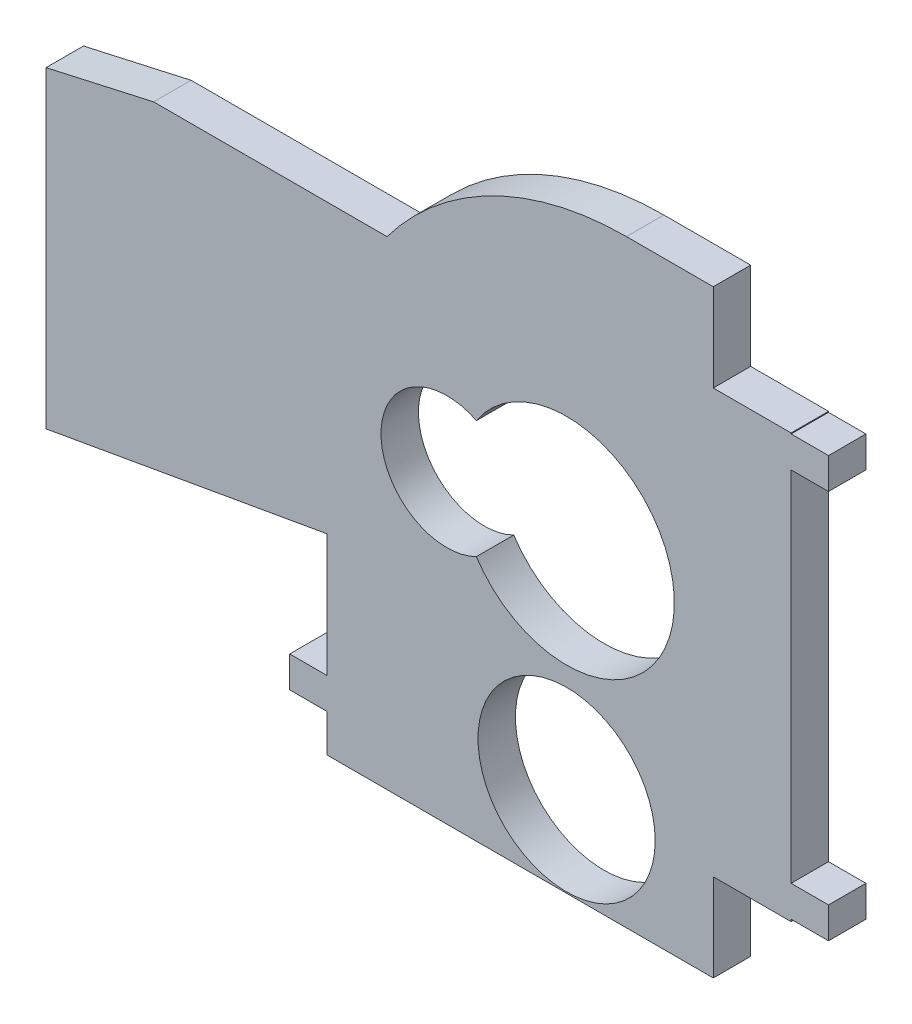
ISO-10303-21;
HEADER;
FILE_DESCRIPTION(('STEP AP214'),'2;1');
FILE_NAME('part.step','',(''),(''),'','','');
FILE_SCHEMA(('AUTOMOTIVE_DESIGN { 1 0 10303 214 1 1 1 1 }'));
ENDSEC;
DATA;
#1=APPLICATION_CONTEXT('core data for automotive mechanical design processes');
#2=APPLICATION_PROTOCOL_DEFINITION('international standard','automotive_design',2000,#1);
#3=PRODUCT_CONTEXT('',#1,'mechanical');
#4=PRODUCT('Part','Part','',(#3));
#5=PRODUCT_RELATED_PRODUCT_CATEGORY('part','',(#4));
#6=PRODUCT_DEFINITION_FORMATION('','',#4);
#7=PRODUCT_DEFINITION_CONTEXT('part definition',#1,'design');
#8=PRODUCT_DEFINITION('design','',#6,#7);
#9=PRODUCT_DEFINITION_SHAPE('','',#8);
#10=(LENGTH_UNIT() NAMED_UNIT(*) SI_UNIT(.MILLI.,.METRE.));
#11=(NAMED_UNIT(*) PLANE_ANGLE_UNIT() SI_UNIT($,.RADIAN.));
#12=(NAMED_UNIT(*) SI_UNIT($,.STERADIAN.) SOLID_ANGLE_UNIT());
#13=UNCERTAINTY_MEASURE_WITH_UNIT(LENGTH_MEASURE(1.E-05),#10,'distance_accuracy_value','');
#14=(GEOMETRIC_REPRESENTATION_CONTEXT(3) GLOBAL_UNCERTAINTY_ASSIGNED_CONTEXT((#13)) GLOBAL_UNIT_ASSIGNED_CONTEXT((#10,
#11,#12)) REPRESENTATION_CONTEXT('',''));
#15=CARTESIAN_POINT('',(0.,0.,0.));
#16=DIRECTION('',(0.,0.,1.));
#17=DIRECTION('',(1.,0.,0.));
#18=AXIS2_PLACEMENT_3D('',#15,#16,#17);
#19=CARTESIAN_POINT('',(-4.40979382225198,-23.9242218820393,1.5875));
#20=DIRECTION('',(0.,0.,1.));
#21=DIRECTION('',(1.,0.,0.));
#22=AXIS2_PLACEMENT_3D('',#19,#20,#21);
#23=PLANE('',#22);
#24=CARTESIAN_POINT('',(-5.08,9.144,1.5875));
#25=DIRECTION('',(0.,0.,1.));
#26=DIRECTION('',(1.,0.,0.));
#27=AXIS2_PLACEMENT_3D('',#24,#25,#26);
#28=CIRCLE('',#27,2.794);
#29=CARTESIAN_POINT('',(-3.82905,11.6423114492593,1.5875));
#30=VERTEX_POINT('',#29);
#31=CARTESIAN_POINT('',(-3.82905,6.64568855074072,1.5875));
#32=VERTEX_POINT('',#31);
#33=EDGE_CURVE('E259',#30,#32,#28,.T.);
#34=ORIENTED_EDGE('',*,*,#33,.F.);
#35=CARTESIAN_POINT('',(0.,9.144,1.5875));
#36=DIRECTION('',(0.,0.,1.));
#37=DIRECTION('',(1.,0.,0.));
#38=AXIS2_PLACEMENT_3D('',#35,#36,#37);
#39=CIRCLE('',#38,4.572);
#40=EDGE_CURVE('E262',#32,#30,#39,.T.);
#41=ORIENTED_EDGE('',*,*,#40,.F.);
#42=EDGE_LOOP('',(#34,#41));
#43=FACE_BOUND('',#42,.T.);
#44=CARTESIAN_POINT('',(0.,0.,1.5875));
#45=DIRECTION('',(0.,0.,1.));
#46=DIRECTION('',(1.,0.,0.));
#47=AXIS2_PLACEMENT_3D('',#44,#45,#46);
#48=CIRCLE('',#47,3.7592);
#49=CARTESIAN_POINT('',(3.7592,0.,1.5875));
#50=VERTEX_POINT('',#49);
#51=EDGE_CURVE('E266',#50,#50,#48,.T.);
#52=ORIENTED_EDGE('',*,*,#51,.F.);
#53=EDGE_LOOP('',(#52));
#54=FACE_BOUND('',#53,.T.);
#55=DIRECTION('',(1.,0.,0.));
#56=VECTOR('',#55,1.);
#57=CARTESIAN_POINT('',(-5.48621075951455,17.8689,1.5875));
#58=LINE('',#57,#56);
#59=CARTESIAN_POINT('',(6.22299999999988,17.8689,1.5875));
#60=VERTEX_POINT('',#59);
#61=CARTESIAN_POINT('',(9.52499999999987,17.8689,1.5875));
#62=VERTEX_POINT('',#61);
#63=EDGE_CURVE('E52',#60,#62,#58,.T.);
#64=ORIENTED_EDGE('',*,*,#63,.F.);
#65=DIRECTION('',(0.,1.,0.));
#66=VECTOR('',#65,1.);
#67=CARTESIAN_POINT('',(6.22299999999989,-23.7640869080621,1.5875));
#68=LINE('',#67,#66);
#69=CARTESIAN_POINT('',(6.22299999999988,21.59,1.5875));
#70=VERTEX_POINT('',#69);
#71=EDGE_CURVE('E221',#60,#70,#68,.T.);
#72=ORIENTED_EDGE('',*,*,#71,.T.);
#73=DIRECTION('',(1.,0.,0.));
#74=VECTOR('',#73,1.);
#75=CARTESIAN_POINT('',(-4.40979382225196,21.59,1.5875));
#76=LINE('',#75,#74);
#77=CARTESIAN_POINT('',(2.53999999999987,21.59,1.5875));
#78=VERTEX_POINT('',#77);
#79=EDGE_CURVE('E269',#78,#70,#76,.T.);
#80=ORIENTED_EDGE('',*,*,#79,.F.);
#81=CARTESIAN_POINT('',(2.53999999999988,8.89,1.5875));
#82=DIRECTION('',(0.,0.,1.));
#83=DIRECTION('',(1.,0.,0.));
#84=AXIS2_PLACEMENT_3D('',#81,#82,#83);
#85=CIRCLE('',#84,12.7);
#86=CARTESIAN_POINT('',(-7.62000000000013,16.51,1.5875));
#87=VERTEX_POINT('',#86);
#88=EDGE_CURVE('E272',#78,#87,#85,.T.);
#89=ORIENTED_EDGE('',*,*,#88,.T.);
#90=DIRECTION('',(-1.,0.,0.));
#91=VECTOR('',#90,1.);
#92=CARTESIAN_POINT('',(-4.40979382225199,16.51,1.5875));
#93=LINE('',#92,#91);
#94=CARTESIAN_POINT('',(-17.5194607595146,16.51,1.5875));
#95=VERTEX_POINT('',#94);
#96=EDGE_CURVE('E275',#87,#95,#93,.T.);
#97=ORIENTED_EDGE('',*,*,#96,.T.);
#98=DIRECTION('',(0.975802126437272,0.218655459663136,0.));
#99=VECTOR('',#98,1.);
#100=CARTESIAN_POINT('',(-13.6637957704053,17.3739683985716,1.5875));
#101=LINE('',#100,#99);
#102=CARTESIAN_POINT('',(-22.0849215190291,15.4869822242647,1.5875));
#103=VERTEX_POINT('',#102);
#104=EDGE_CURVE('E277',#103,#95,#101,.T.);
#105=ORIENTED_EDGE('',*,*,#104,.F.);
#106=DIRECTION('',(0.,1.,0.));
#107=VECTOR('',#106,1.);
#108=CARTESIAN_POINT('',(-22.0849215190291,-23.9242218820393,1.5875));
#109=LINE('',#108,#107);
#110=CARTESIAN_POINT('',(-22.0849215190291,2.21200741234466,1.5875));
#111=VERTEX_POINT('',#110);
#112=EDGE_CURVE('E280',#111,#103,#109,.T.);
#113=ORIENTED_EDGE('',*,*,#112,.F.);
#114=DIRECTION('',(0.984761013296185,0.173913043478261,0.));
#115=VECTOR('',#114,1.);
#116=CARTESIAN_POINT('',(-9.42055467360718,4.44858923481173,1.5875));
#117=LINE('',#116,#115);
#118=CARTESIAN_POINT('',(-10.1600000000001,4.318,1.5875));
#119=VERTEX_POINT('',#118);
#120=EDGE_CURVE('E283',#111,#119,#117,.T.);
#121=ORIENTED_EDGE('',*,*,#120,.T.);
#122=DIRECTION('',(0.,-1.,0.));
#123=VECTOR('',#122,1.);
#124=CARTESIAN_POINT('',(-10.1600000000001,-23.9242218820393,1.5875));
#125=LINE('',#124,#123);
#126=CARTESIAN_POINT('',(-10.1600000000001,-0.889000000000001,1.5875));
#127=VERTEX_POINT('',#126);
#128=EDGE_CURVE('E286',#119,#127,#125,.T.);
#129=ORIENTED_EDGE('',*,*,#128,.T.);
#130=DIRECTION('',(1.,0.,0.));
#131=VECTOR('',#130,1.);
#132=CARTESIAN_POINT('',(-4.40979382225198,-0.889000000000001,1.5875));
#133=LINE('',#132,#131);
#134=CARTESIAN_POINT('',(-11.7475000000001,-0.889000000000001,1.5875));
#135=VERTEX_POINT('',#134);
#136=EDGE_CURVE('E288',#135,#127,#133,.T.);
#137=ORIENTED_EDGE('',*,*,#136,.F.);
#138=DIRECTION('',(0.,1.,0.));
#139=VECTOR('',#138,1.);
#140=CARTESIAN_POINT('',(-11.7475000000001,-23.9242218820393,1.5875));
#141=LINE('',#140,#139);
#142=CARTESIAN_POINT('',(-11.7475000000001,-2.2098,1.5875));
#143=VERTEX_POINT('',#142);
#144=EDGE_CURVE('E292',#143,#135,#141,.T.);
#145=ORIENTED_EDGE('',*,*,#144,.F.);
#146=DIRECTION('',(1.,0.,0.));
#147=VECTOR('',#146,1.);
#148=CARTESIAN_POINT('',(-4.40979382225198,-2.2098,1.5875));
#149=LINE('',#148,#147);
#150=CARTESIAN_POINT('',(-10.1600000000001,-2.2098,1.5875));
#151=VERTEX_POINT('',#150);
#152=EDGE_CURVE('E295',#143,#151,#149,.T.);
#153=ORIENTED_EDGE('',*,*,#152,.T.);
#154=CARTESIAN_POINT('',(-10.1600000000001,-3.81,1.5875));
#155=VERTEX_POINT('',#154);
#156=EDGE_CURVE('E289',#151,#155,#125,.T.);
#157=ORIENTED_EDGE('',*,*,#156,.T.);
#158=DIRECTION('',(1.,0.,0.));
#159=VECTOR('',#158,1.);
#160=CARTESIAN_POINT('',(-4.40979382225198,-3.81,1.5875));
#161=LINE('',#160,#159);
#162=CARTESIAN_POINT('',(6.22299999999988,-3.81,1.5875));
#163=VERTEX_POINT('',#162);
#164=EDGE_CURVE('E298',#155,#163,#161,.T.);
#165=ORIENTED_EDGE('',*,*,#164,.T.);
#166=DIRECTION('',(0.,1.,0.));
#167=VECTOR('',#166,1.);
#168=CARTESIAN_POINT('',(6.22299999999988,-23.7640869080621,1.5875));
#169=LINE('',#168,#167);
#170=CARTESIAN_POINT('',(6.22299999999988,-0.0889000000000133,1.5875));
#171=VERTEX_POINT('',#170);
#172=EDGE_CURVE('E248',#163,#171,#169,.T.);
#173=ORIENTED_EDGE('',*,*,#172,.T.);
#174=DIRECTION('',(1.,0.,0.));
#175=VECTOR('',#174,1.);
#176=CARTESIAN_POINT('',(-5.48621075951455,-0.0889000000000098,1.5875));
#177=LINE('',#176,#175);
#178=CARTESIAN_POINT('',(9.52499999999988,-0.0889000000000098,1.5875));
#179=VERTEX_POINT('',#178);
#180=EDGE_CURVE('E245',#171,#179,#177,.T.);
#181=ORIENTED_EDGE('',*,*,#180,.T.);
#182=DIRECTION('',(0.,-1.,0.));
#183=VECTOR('',#182,1.);
#184=CARTESIAN_POINT('',(9.52499999999988,-23.9242218820393,1.5875));
#185=LINE('',#184,#183);
#186=CARTESIAN_POINT('',(9.52499999999988,0.,1.5875));
#187=VERTEX_POINT('',#186);
#188=EDGE_CURVE('E301',#187,#179,#185,.T.);
#189=ORIENTED_EDGE('',*,*,#188,.F.);
#190=DIRECTION('',(1.,0.,0.));
#191=VECTOR('',#190,1.);
#192=CARTESIAN_POINT('',(-4.40979382225199,0.,1.5875));
#193=LINE('',#192,#191);
#194=CARTESIAN_POINT('',(11.1125,0.,1.5875));
#195=VERTEX_POINT('',#194);
#196=EDGE_CURVE('E304',#187,#195,#193,.T.);
#197=ORIENTED_EDGE('',*,*,#196,.T.);
#198=DIRECTION('',(0.,1.,0.));
#199=VECTOR('',#198,1.);
#200=CARTESIAN_POINT('',(11.1125,-23.9242218820393,1.5875));
#201=LINE('',#200,#199);
#202=CARTESIAN_POINT('',(11.1125,1.3208,1.5875));
#203=VERTEX_POINT('',#202);
#204=EDGE_CURVE('E309',#195,#203,#201,.T.);
#205=ORIENTED_EDGE('',*,*,#204,.T.);
#206=DIRECTION('',(1.,0.,0.));
#207=VECTOR('',#206,1.);
#208=CARTESIAN_POINT('',(-4.40979382225198,1.3208,1.5875));
#209=LINE('',#208,#207);
#210=CARTESIAN_POINT('',(9.52499999999988,1.3208,1.5875));
#211=VERTEX_POINT('',#210);
#212=EDGE_CURVE('E311',#211,#203,#209,.T.);
#213=ORIENTED_EDGE('',*,*,#212,.F.);
#214=CARTESIAN_POINT('',(9.52499999999985,16.51,1.5875));
#215=VERTEX_POINT('',#214);
#216=EDGE_CURVE('E306',#215,#211,#185,.T.);
#217=ORIENTED_EDGE('',*,*,#216,.F.);
#218=DIRECTION('',(1.,0.,0.));
#219=VECTOR('',#218,1.);
#220=CARTESIAN_POINT('',(-4.40979382225198,16.51,1.5875));
#221=LINE('',#220,#219);
#222=CARTESIAN_POINT('',(11.1124999999999,16.51,1.5875));
#223=VERTEX_POINT('',#222);
#224=EDGE_CURVE('E314',#215,#223,#221,.T.);
#225=ORIENTED_EDGE('',*,*,#224,.T.);
#226=DIRECTION('',(0.,1.,0.));
#227=VECTOR('',#226,1.);
#228=CARTESIAN_POINT('',(11.1124999999999,-23.9242218820393,1.5875));
#229=LINE('',#228,#227);
#230=CARTESIAN_POINT('',(11.1124999999999,17.8308,1.5875));
#231=VERTEX_POINT('',#230);
#232=EDGE_CURVE('E317',#223,#231,#229,.T.);
#233=ORIENTED_EDGE('',*,*,#232,.T.);
#234=DIRECTION('',(1.,0.,0.));
#235=VECTOR('',#234,1.);
#236=CARTESIAN_POINT('',(-4.40979382225198,17.8308,1.5875));
#237=LINE('',#236,#235);
#238=CARTESIAN_POINT('',(9.52499999999987,17.8308,1.5875));
#239=VERTEX_POINT('',#238);
#240=EDGE_CURVE('E319',#239,#231,#237,.T.);
#241=ORIENTED_EDGE('',*,*,#240,.F.);
#242=EDGE_CURVE('E305',#62,#239,#185,.T.);
#243=ORIENTED_EDGE('',*,*,#242,.F.);
#244=EDGE_LOOP('',(#64,#72,#80,#89,#97,#105,#113,#121,#129,#137,#145,#153,#157,#165,#173,#181,
#189,#197,#205,#213,#217,#225,#233,#241,#243));
#245=FACE_BOUND('',#244,.T.);
#246=ADVANCED_FACE('F35',(#43,#54,#245),#23,.T.);
#247=CARTESIAN_POINT('',(-4.40979382225198,-23.9242218820393,0.));
#248=DIRECTION('',(0.,0.,1.));
#249=DIRECTION('',(1.,0.,0.));
#250=AXIS2_PLACEMENT_3D('',#247,#248,#249);
#251=PLANE('',#250);
#252=CARTESIAN_POINT('',(-5.08,9.144,0.));
#253=DIRECTION('',(0.,0.,1.));
#254=DIRECTION('',(1.,0.,0.));
#255=AXIS2_PLACEMENT_3D('',#252,#253,#254);
#256=CIRCLE('',#255,2.794);
#257=CARTESIAN_POINT('',(-3.82905,11.6423114492593,0.));
#258=VERTEX_POINT('',#257);
#259=CARTESIAN_POINT('',(-3.82905,6.64568855074072,0.));
#260=VERTEX_POINT('',#259);
#261=EDGE_CURVE('E258',#258,#260,#256,.T.);
#262=ORIENTED_EDGE('',*,*,#261,.T.);
#263=CARTESIAN_POINT('',(0.,9.144,0.));
#264=DIRECTION('',(0.,0.,1.));
#265=DIRECTION('',(1.,0.,0.));
#266=AXIS2_PLACEMENT_3D('',#263,#264,#265);
#267=CIRCLE('',#266,4.572);
#268=EDGE_CURVE('E324',#260,#258,#267,.T.);
#269=ORIENTED_EDGE('',*,*,#268,.T.);
#270=EDGE_LOOP('',(#262,#269));
#271=FACE_BOUND('',#270,.T.);
#272=CARTESIAN_POINT('',(0.,0.,0.));
#273=DIRECTION('',(0.,0.,1.));
#274=DIRECTION('',(1.,0.,0.));
#275=AXIS2_PLACEMENT_3D('',#272,#273,#274);
#276=CIRCLE('',#275,3.7592);
#277=CARTESIAN_POINT('',(3.7592,0.,0.));
#278=VERTEX_POINT('',#277);
#279=EDGE_CURVE('E327',#278,#278,#276,.T.);
#280=ORIENTED_EDGE('',*,*,#279,.T.);
#281=EDGE_LOOP('',(#280));
#282=FACE_BOUND('',#281,.T.);
#283=DIRECTION('',(0.,-1.,0.));
#284=VECTOR('',#283,1.);
#285=CARTESIAN_POINT('',(6.22299999999989,-23.7640869080621,0.));
#286=LINE('',#285,#284);
#287=CARTESIAN_POINT('',(6.22299999999988,21.59,0.));
#288=VERTEX_POINT('',#287);
#289=CARTESIAN_POINT('',(6.22299999999988,17.8689,0.));
#290=VERTEX_POINT('',#289);
#291=EDGE_CURVE('E218',#288,#290,#286,.T.);
#292=ORIENTED_EDGE('',*,*,#291,.T.);
#293=DIRECTION('',(-1.,0.,0.));
#294=VECTOR('',#293,1.);
#295=CARTESIAN_POINT('',(-5.48621075951455,17.8689,0.));
#296=LINE('',#295,#294);
#297=CARTESIAN_POINT('',(9.52499999999987,17.8689,0.));
#298=VERTEX_POINT('',#297);
#299=EDGE_CURVE('E225',#298,#290,#296,.T.);
#300=ORIENTED_EDGE('',*,*,#299,.F.);
#301=DIRECTION('',(0.,-1.,0.));
#302=VECTOR('',#301,1.);
#303=CARTESIAN_POINT('',(9.52499999999988,-23.9242218820393,0.));
#304=LINE('',#303,#302);
#305=CARTESIAN_POINT('',(9.52499999999987,17.8308,0.));
#306=VERTEX_POINT('',#305);
#307=EDGE_CURVE('E263',#298,#306,#304,.T.);
#308=ORIENTED_EDGE('',*,*,#307,.T.);
#309=DIRECTION('',(1.,0.,0.));
#310=VECTOR('',#309,1.);
#311=CARTESIAN_POINT('',(-4.40979382225198,17.8308,0.));
#312=LINE('',#311,#310);
#313=CARTESIAN_POINT('',(11.1124999999999,17.8308,0.));
#314=VERTEX_POINT('',#313);
#315=EDGE_CURVE('E381',#306,#314,#312,.T.);
#316=ORIENTED_EDGE('',*,*,#315,.T.);
#317=DIRECTION('',(0.,1.,0.));
#318=VECTOR('',#317,1.);
#319=CARTESIAN_POINT('',(11.1124999999999,-23.9242218820393,0.));
#320=LINE('',#319,#318);
#321=CARTESIAN_POINT('',(11.1124999999999,16.51,0.));
#322=VERTEX_POINT('',#321);
#323=EDGE_CURVE('E378',#322,#314,#320,.T.);
#324=ORIENTED_EDGE('',*,*,#323,.F.);
#325=DIRECTION('',(1.,0.,0.));
#326=VECTOR('',#325,1.);
#327=CARTESIAN_POINT('',(-4.40979382225198,16.51,0.));
#328=LINE('',#327,#326);
#329=CARTESIAN_POINT('',(9.52499999999985,16.51,0.));
#330=VERTEX_POINT('',#329);
#331=EDGE_CURVE('E375',#330,#322,#328,.T.);
#332=ORIENTED_EDGE('',*,*,#331,.F.);
#333=CARTESIAN_POINT('',(9.52499999999988,1.3208,0.));
#334=VERTEX_POINT('',#333);
#335=EDGE_CURVE('E366',#330,#334,#304,.T.);
#336=ORIENTED_EDGE('',*,*,#335,.T.);
#337=DIRECTION('',(1.,0.,0.));
#338=VECTOR('',#337,1.);
#339=CARTESIAN_POINT('',(-4.40979382225198,1.3208,0.));
#340=LINE('',#339,#338);
#341=CARTESIAN_POINT('',(11.1125,1.3208,0.));
#342=VERTEX_POINT('',#341);
#343=EDGE_CURVE('E372',#334,#342,#340,.T.);
#344=ORIENTED_EDGE('',*,*,#343,.T.);
#345=DIRECTION('',(0.,1.,0.));
#346=VECTOR('',#345,1.);
#347=CARTESIAN_POINT('',(11.1125,-23.9242218820393,0.));
#348=LINE('',#347,#346);
#349=CARTESIAN_POINT('',(11.1125,0.,0.));
#350=VERTEX_POINT('',#349);
#351=EDGE_CURVE('E369',#350,#342,#348,.T.);
#352=ORIENTED_EDGE('',*,*,#351,.F.);
#353=DIRECTION('',(1.,0.,0.));
#354=VECTOR('',#353,1.);
#355=CARTESIAN_POINT('',(-4.40979382225199,0.,0.));
#356=LINE('',#355,#354);
#357=CARTESIAN_POINT('',(9.52499999999988,0.,0.));
#358=VERTEX_POINT('',#357);
#359=EDGE_CURVE('E365',#358,#350,#356,.T.);
#360=ORIENTED_EDGE('',*,*,#359,.F.);
#361=CARTESIAN_POINT('',(9.52499999999988,-0.0889000000000098,0.));
#362=VERTEX_POINT('',#361);
#363=EDGE_CURVE('E362',#358,#362,#304,.T.);
#364=ORIENTED_EDGE('',*,*,#363,.T.);
#365=DIRECTION('',(-1.,0.,0.));
#366=VECTOR('',#365,1.);
#367=CARTESIAN_POINT('',(-5.48621075951455,-0.0889000000000098,0.));
#368=LINE('',#367,#366);
#369=CARTESIAN_POINT('',(6.22299999999988,-0.0889000000000133,0.));
#370=VERTEX_POINT('',#369);
#371=EDGE_CURVE('E229',#362,#370,#368,.T.);
#372=ORIENTED_EDGE('',*,*,#371,.T.);
#373=DIRECTION('',(0.,-1.,0.));
#374=VECTOR('',#373,1.);
#375=CARTESIAN_POINT('',(6.22299999999988,-23.7640869080621,0.));
#376=LINE('',#375,#374);
#377=CARTESIAN_POINT('',(6.22299999999988,-3.81,0.));
#378=VERTEX_POINT('',#377);
#379=EDGE_CURVE('E254',#370,#378,#376,.T.);
#380=ORIENTED_EDGE('',*,*,#379,.T.);
#381=DIRECTION('',(1.,0.,0.));
#382=VECTOR('',#381,1.);
#383=CARTESIAN_POINT('',(-4.40979382225198,-3.81,0.));
#384=LINE('',#383,#382);
#385=CARTESIAN_POINT('',(-10.1600000000001,-3.81,0.));
#386=VERTEX_POINT('',#385);
#387=EDGE_CURVE('E359',#386,#378,#384,.T.);
#388=ORIENTED_EDGE('',*,*,#387,.F.);
#389=DIRECTION('',(0.,-1.,0.));
#390=VECTOR('',#389,1.);
#391=CARTESIAN_POINT('',(-10.1600000000001,-23.9242218820393,0.));
#392=LINE('',#391,#390);
#393=CARTESIAN_POINT('',(-10.1600000000001,-2.2098,0.));
#394=VERTEX_POINT('',#393);
#395=EDGE_CURVE('E350',#394,#386,#392,.T.);
#396=ORIENTED_EDGE('',*,*,#395,.F.);
#397=DIRECTION('',(1.,0.,0.));
#398=VECTOR('',#397,1.);
#399=CARTESIAN_POINT('',(-4.40979382225198,-2.2098,0.));
#400=LINE('',#399,#398);
#401=CARTESIAN_POINT('',(-11.7475000000001,-2.2098,0.));
#402=VERTEX_POINT('',#401);
#403=EDGE_CURVE('E356',#402,#394,#400,.T.);
#404=ORIENTED_EDGE('',*,*,#403,.F.);
#405=DIRECTION('',(0.,1.,0.));
#406=VECTOR('',#405,1.);
#407=CARTESIAN_POINT('',(-11.7475000000001,-23.9242218820393,0.));
#408=LINE('',#407,#406);
#409=CARTESIAN_POINT('',(-11.7475000000001,-0.889000000000001,0.));
#410=VERTEX_POINT('',#409);
#411=EDGE_CURVE('E353',#402,#410,#408,.T.);
#412=ORIENTED_EDGE('',*,*,#411,.T.);
#413=DIRECTION('',(1.,0.,0.));
#414=VECTOR('',#413,1.);
#415=CARTESIAN_POINT('',(-4.40979382225198,-0.889000000000001,0.));
#416=LINE('',#415,#414);
#417=CARTESIAN_POINT('',(-10.1600000000001,-0.889000000000001,0.));
#418=VERTEX_POINT('',#417);
#419=EDGE_CURVE('E349',#410,#418,#416,.T.);
#420=ORIENTED_EDGE('',*,*,#419,.T.);
#421=CARTESIAN_POINT('',(-10.1600000000001,4.318,0.));
#422=VERTEX_POINT('',#421);
#423=EDGE_CURVE('E346',#422,#418,#392,.T.);
#424=ORIENTED_EDGE('',*,*,#423,.F.);
#425=DIRECTION('',(0.984761013296185,0.173913043478261,0.));
#426=VECTOR('',#425,1.);
#427=CARTESIAN_POINT('',(-9.42055467360718,4.44858923481173,0.));
#428=LINE('',#427,#426);
#429=CARTESIAN_POINT('',(-22.0849215190291,2.21200741234466,0.));
#430=VERTEX_POINT('',#429);
#431=EDGE_CURVE('E343',#430,#422,#428,.T.);
#432=ORIENTED_EDGE('',*,*,#431,.F.);
#433=DIRECTION('',(0.,1.,0.));
#434=VECTOR('',#433,1.);
#435=CARTESIAN_POINT('',(-22.0849215190291,-23.9242218820393,0.));
#436=LINE('',#435,#434);
#437=CARTESIAN_POINT('',(-22.0849215190291,15.4869822242647,0.));
#438=VERTEX_POINT('',#437);
#439=EDGE_CURVE('E340',#430,#438,#436,.T.);
#440=ORIENTED_EDGE('',*,*,#439,.T.);
#441=DIRECTION('',(0.975802126437272,0.218655459663136,0.));
#442=VECTOR('',#441,1.);
#443=CARTESIAN_POINT('',(-13.6637957704053,17.3739683985716,0.));
#444=LINE('',#443,#442);
#445=CARTESIAN_POINT('',(-17.5194607595146,16.51,0.));
#446=VERTEX_POINT('',#445);
#447=EDGE_CURVE('E337',#438,#446,#444,.T.);
#448=ORIENTED_EDGE('',*,*,#447,.T.);
#449=DIRECTION('',(-1.,0.,0.));
#450=VECTOR('',#449,1.);
#451=CARTESIAN_POINT('',(-4.40979382225199,16.51,0.));
#452=LINE('',#451,#450);
#453=CARTESIAN_POINT('',(-7.62000000000013,16.51,0.));
#454=VERTEX_POINT('',#453);
#455=EDGE_CURVE('E334',#454,#446,#452,.T.);
#456=ORIENTED_EDGE('',*,*,#455,.F.);
#457=CARTESIAN_POINT('',(2.53999999999988,8.89,0.));
#458=DIRECTION('',(0.,0.,1.));
#459=DIRECTION('',(1.,0.,0.));
#460=AXIS2_PLACEMENT_3D('',#457,#458,#459);
#461=CIRCLE('',#460,12.7);
#462=CARTESIAN_POINT('',(2.53999999999987,21.59,0.));
#463=VERTEX_POINT('',#462);
#464=EDGE_CURVE('E331',#463,#454,#461,.T.);
#465=ORIENTED_EDGE('',*,*,#464,.F.);
#466=DIRECTION('',(1.,0.,0.));
#467=VECTOR('',#466,1.);
#468=CARTESIAN_POINT('',(-4.40979382225196,21.59,0.));
#469=LINE('',#468,#467);
#470=EDGE_CURVE('E236',#463,#288,#469,.T.);
#471=ORIENTED_EDGE('',*,*,#470,.T.);
#472=EDGE_LOOP('',(#292,#300,#308,#316,#324,#332,#336,#344,#352,#360,#364,#372,#380,#388,#396,
#404,#412,#420,#424,#432,#440,#448,#456,#465,#471));
#473=FACE_BOUND('',#472,.T.);
#474=ADVANCED_FACE('F233',(#271,#282,#473),#251,.F.);
#475=CARTESIAN_POINT('',(-4.40979382225196,21.59,1.5875));
#476=DIRECTION('',(0.,1.,0.));
#477=DIRECTION('',(-1.,0.,0.));
#478=AXIS2_PLACEMENT_3D('',#475,#476,#477);
#479=PLANE('',#478);
#480=ORIENTED_EDGE('',*,*,#79,.T.);
#481=DIRECTION('',(0.,0.,1.));
#482=VECTOR('',#481,1.);
#483=CARTESIAN_POINT('',(6.22299999999988,21.59,-0.000999999999999916));
#484=LINE('',#483,#482);
#485=EDGE_CURVE('E230',#288,#70,#484,.T.);
#486=ORIENTED_EDGE('',*,*,#485,.F.);
#487=ORIENTED_EDGE('',*,*,#470,.F.);
#488=DIRECTION('',(0.,0.,-1.));
#489=VECTOR('',#488,1.);
#490=CARTESIAN_POINT('',(2.53999999999987,21.59,1.5875));
#491=LINE('',#490,#489);
#492=EDGE_CURVE('E11',#78,#463,#491,.T.);
#493=ORIENTED_EDGE('',*,*,#492,.F.);
#494=EDGE_LOOP('',(#480,#486,#487,#493));
#495=FACE_BOUND('',#494,.T.);
#496=ADVANCED_FACE('F472',(#495),#479,.T.);
#497=CARTESIAN_POINT('',(-4.40979382225198,-3.81,1.5875));
#498=DIRECTION('',(0.,1.,0.));
#499=DIRECTION('',(0.,0.,1.));
#500=AXIS2_PLACEMENT_3D('',#497,#498,#499);
#501=PLANE('',#500);
#502=DIRECTION('',(0.,0.,1.));
#503=VECTOR('',#502,1.);
#504=CARTESIAN_POINT('',(6.22299999999988,-3.81,-0.000999999999999916));
#505=LINE('',#504,#503);
#506=EDGE_CURVE('E60',#378,#163,#505,.T.);
#507=ORIENTED_EDGE('',*,*,#506,.T.);
#508=ORIENTED_EDGE('',*,*,#164,.F.);
#509=DIRECTION('',(0.,0.,-1.));
#510=VECTOR('',#509,1.);
#511=CARTESIAN_POINT('',(-10.1600000000001,-3.81,1.5875));
#512=LINE('',#511,#510);
#513=EDGE_CURVE('E403',#155,#386,#512,.T.);
#514=ORIENTED_EDGE('',*,*,#513,.T.);
#515=ORIENTED_EDGE('',*,*,#387,.T.);
#516=EDGE_LOOP('',(#507,#508,#514,#515));
#517=FACE_BOUND('',#516,.T.);
#518=ADVANCED_FACE('F503',(#517),#501,.F.);
#519=CARTESIAN_POINT('',(9.52499999999988,-23.9242218820393,1.5875));
#520=DIRECTION('',(1.,0.,0.));
#521=DIRECTION('',(0.,1.,0.));
#522=AXIS2_PLACEMENT_3D('',#519,#520,#521);
#523=PLANE('',#522);
#524=ORIENTED_EDGE('',*,*,#188,.T.);
#525=DIRECTION('',(0.,0.,1.));
#526=VECTOR('',#525,1.);
#527=CARTESIAN_POINT('',(9.52499999999988,-0.0889000000000098,-0.000999999999999916));
#528=LINE('',#527,#526);
#529=EDGE_CURVE('E252',#362,#179,#528,.T.);
#530=ORIENTED_EDGE('',*,*,#529,.F.);
#531=ORIENTED_EDGE('',*,*,#363,.F.);
#532=DIRECTION('',(0.,0.,-1.));
#533=VECTOR('',#532,1.);
#534=CARTESIAN_POINT('',(9.52499999999988,0.,1.5875));
#535=LINE('',#534,#533);
#536=EDGE_CURVE('E401',#187,#358,#535,.T.);
#537=ORIENTED_EDGE('',*,*,#536,.F.);
#538=EDGE_LOOP('',(#524,#530,#531,#537));
#539=FACE_BOUND('',#538,.T.);
#540=ADVANCED_FACE('F464',(#539),#523,.T.);
#541=CARTESIAN_POINT('',(2.53999999999988,8.89,1.5875));
#542=DIRECTION('',(0.,0.,-1.));
#543=DIRECTION('',(-1.,0.,0.));
#544=AXIS2_PLACEMENT_3D('',#541,#542,#543);
#545=CYLINDRICAL_SURFACE('',#544,12.7);
#546=ORIENTED_EDGE('',*,*,#464,.T.);
#547=DIRECTION('',(0.,0.,-1.));
#548=VECTOR('',#547,1.);
#549=CARTESIAN_POINT('',(-7.62000000000013,16.51,1.5875));
#550=LINE('',#549,#548);
#551=EDGE_CURVE('E44',#87,#454,#550,.T.);
#552=ORIENTED_EDGE('',*,*,#551,.F.);
#553=ORIENTED_EDGE('',*,*,#88,.F.);
#554=ORIENTED_EDGE('',*,*,#492,.T.);
#555=EDGE_LOOP('',(#546,#552,#553,#554));
#556=FACE_BOUND('',#555,.T.);
#557=ADVANCED_FACE('F505',(#556),#545,.T.);
#558=CARTESIAN_POINT('',(-4.40979382225199,16.51,1.5875));
#559=DIRECTION('',(0.,-1.,0.));
#560=DIRECTION('',(1.,0.,0.));
#561=AXIS2_PLACEMENT_3D('',#558,#559,#560);
#562=PLANE('',#561);
#563=ORIENTED_EDGE('',*,*,#455,.T.);
#564=DIRECTION('',(0.,0.,-1.));
#565=VECTOR('',#564,1.);
#566=CARTESIAN_POINT('',(-17.5194607595146,16.51,1.5875));
#567=LINE('',#566,#565);
#568=EDGE_CURVE('E422',#95,#446,#567,.T.);
#569=ORIENTED_EDGE('',*,*,#568,.F.);
#570=ORIENTED_EDGE('',*,*,#96,.F.);
#571=ORIENTED_EDGE('',*,*,#551,.T.);
#572=EDGE_LOOP('',(#563,#569,#570,#571));
#573=FACE_BOUND('',#572,.T.);
#574=ADVANCED_FACE('F508',(#573),#562,.F.);
#575=CARTESIAN_POINT('',(-13.6637957704053,17.3739683985716,1.5875));
#576=DIRECTION('',(-0.218655459663136,0.975802126437272,0.));
#577=DIRECTION('',(-0.975802126437272,-0.218655459663136,0.));
#578=AXIS2_PLACEMENT_3D('',#575,#576,#577);
#579=PLANE('',#578);
#580=ORIENTED_EDGE('',*,*,#447,.F.);
#581=DIRECTION('',(0.,0.,-1.));
#582=VECTOR('',#581,1.);
#583=CARTESIAN_POINT('',(-22.0849215190291,15.4869822242647,1.5875));
#584=LINE('',#583,#582);
#585=EDGE_CURVE('E420',#103,#438,#584,.T.);
#586=ORIENTED_EDGE('',*,*,#585,.F.);
#587=ORIENTED_EDGE('',*,*,#104,.T.);
#588=ORIENTED_EDGE('',*,*,#568,.T.);
#589=EDGE_LOOP('',(#580,#586,#587,#588));
#590=FACE_BOUND('',#589,.T.);
#591=ADVANCED_FACE('F512',(#590),#579,.T.);
#592=CARTESIAN_POINT('',(-22.0849215190291,-23.9242218820393,1.5875));
#593=DIRECTION('',(-1.,0.,0.));
#594=DIRECTION('',(0.,0.,1.));
#595=AXIS2_PLACEMENT_3D('',#592,#593,#594);
#596=PLANE('',#595);
#597=ORIENTED_EDGE('',*,*,#439,.F.);
#598=DIRECTION('',(0.,0.,-1.));
#599=VECTOR('',#598,1.);
#600=CARTESIAN_POINT('',(-22.0849215190291,2.21200741234466,1.5875));
#601=LINE('',#600,#599);
#602=EDGE_CURVE('E418',#111,#430,#601,.T.);
#603=ORIENTED_EDGE('',*,*,#602,.F.);
#604=ORIENTED_EDGE('',*,*,#112,.T.);
#605=ORIENTED_EDGE('',*,*,#585,.T.);
#606=EDGE_LOOP('',(#597,#603,#604,#605));
#607=FACE_BOUND('',#606,.T.);
#608=ADVANCED_FACE('F516',(#607),#596,.T.);
#609=CARTESIAN_POINT('',(-9.42055467360718,4.44858923481173,1.5875));
#610=DIRECTION('',(-0.173913043478261,0.984761013296185,0.));
#611=DIRECTION('',(-0.984761013296185,-0.173913043478261,0.));
#612=AXIS2_PLACEMENT_3D('',#609,#610,#611);
#613=PLANE('',#612);
#614=ORIENTED_EDGE('',*,*,#431,.T.);
#615=DIRECTION('',(0.,0.,-1.));
#616=VECTOR('',#615,1.);
#617=CARTESIAN_POINT('',(-10.1600000000001,4.318,1.5875));
#618=LINE('',#617,#616);
#619=EDGE_CURVE('E415',#119,#422,#618,.T.);
#620=ORIENTED_EDGE('',*,*,#619,.F.);
#621=ORIENTED_EDGE('',*,*,#120,.F.);
#622=ORIENTED_EDGE('',*,*,#602,.T.);
#623=EDGE_LOOP('',(#614,#620,#621,#622));
#624=FACE_BOUND('',#623,.T.);
#625=ADVANCED_FACE('F520',(#624),#613,.F.);
#626=CARTESIAN_POINT('',(-10.1600000000001,-23.9242218820393,1.5875));
#627=DIRECTION('',(1.,0.,0.));
#628=DIRECTION('',(0.,1.,0.));
#629=AXIS2_PLACEMENT_3D('',#626,#627,#628);
#630=PLANE('',#629);
#631=ORIENTED_EDGE('',*,*,#423,.T.);
#632=DIRECTION('',(0.,0.,-1.));
#633=VECTOR('',#632,1.);
#634=CARTESIAN_POINT('',(-10.1600000000001,-0.889000000000001,1.5875));
#635=LINE('',#634,#633);
#636=EDGE_CURVE('E413',#127,#418,#635,.T.);
#637=ORIENTED_EDGE('',*,*,#636,.F.);
#638=ORIENTED_EDGE('',*,*,#128,.F.);
#639=ORIENTED_EDGE('',*,*,#619,.T.);
#640=EDGE_LOOP('',(#631,#637,#638,#639));
#641=FACE_BOUND('',#640,.T.);
#642=ADVANCED_FACE('F524',(#641),#630,.F.);
#643=CARTESIAN_POINT('',(-4.40979382225198,-0.889000000000001,1.5875));
#644=DIRECTION('',(0.,1.,0.));
#645=DIRECTION('',(0.,0.,1.));
#646=AXIS2_PLACEMENT_3D('',#643,#644,#645);
#647=PLANE('',#646);
#648=ORIENTED_EDGE('',*,*,#419,.F.);
#649=DIRECTION('',(0.,0.,-1.));
#650=VECTOR('',#649,1.);
#651=CARTESIAN_POINT('',(-11.7475000000001,-0.889000000000001,1.5875));
#652=LINE('',#651,#650);
#653=EDGE_CURVE('E411',#135,#410,#652,.T.);
#654=ORIENTED_EDGE('',*,*,#653,.F.);
#655=ORIENTED_EDGE('',*,*,#136,.T.);
#656=ORIENTED_EDGE('',*,*,#636,.T.);
#657=EDGE_LOOP('',(#648,#654,#655,#656));
#658=FACE_BOUND('',#657,.T.);
#659=ADVANCED_FACE('F526',(#658),#647,.T.);
#660=CARTESIAN_POINT('',(-11.7475000000001,-23.9242218820393,1.5875));
#661=DIRECTION('',(-1.,0.,0.));
#662=DIRECTION('',(0.,0.,1.));
#663=AXIS2_PLACEMENT_3D('',#660,#661,#662);
#664=PLANE('',#663);
#665=ORIENTED_EDGE('',*,*,#411,.F.);
#666=DIRECTION('',(0.,0.,-1.));
#667=VECTOR('',#666,1.);
#668=CARTESIAN_POINT('',(-11.7475000000001,-2.2098,1.5875));
#669=LINE('',#668,#667);
#670=EDGE_CURVE('E409',#143,#402,#669,.T.);
#671=ORIENTED_EDGE('',*,*,#670,.F.);
#672=ORIENTED_EDGE('',*,*,#144,.T.);
#673=ORIENTED_EDGE('',*,*,#653,.T.);
#674=EDGE_LOOP('',(#665,#671,#672,#673));
#675=FACE_BOUND('',#674,.T.);
#676=ADVANCED_FACE('F529',(#675),#664,.T.);
#677=CARTESIAN_POINT('',(-4.40979382225198,-2.2098,1.5875));
#678=DIRECTION('',(0.,1.,0.));
#679=DIRECTION('',(0.,0.,1.));
#680=AXIS2_PLACEMENT_3D('',#677,#678,#679);
#681=PLANE('',#680);
#682=ORIENTED_EDGE('',*,*,#403,.T.);
#683=DIRECTION('',(0.,0.,-1.));
#684=VECTOR('',#683,1.);
#685=CARTESIAN_POINT('',(-10.1600000000001,-2.2098,1.5875));
#686=LINE('',#685,#684);
#687=EDGE_CURVE('E406',#151,#394,#686,.T.);
#688=ORIENTED_EDGE('',*,*,#687,.F.);
#689=ORIENTED_EDGE('',*,*,#152,.F.);
#690=ORIENTED_EDGE('',*,*,#670,.T.);
#691=EDGE_LOOP('',(#682,#688,#689,#690));
#692=FACE_BOUND('',#691,.T.);
#693=ADVANCED_FACE('F533',(#692),#681,.F.);
#694=ORIENTED_EDGE('',*,*,#395,.T.);
#695=ORIENTED_EDGE('',*,*,#513,.F.);
#696=ORIENTED_EDGE('',*,*,#156,.F.);
#697=ORIENTED_EDGE('',*,*,#687,.T.);
#698=EDGE_LOOP('',(#694,#695,#696,#697));
#699=FACE_BOUND('',#698,.T.);
#700=ADVANCED_FACE('F537',(#699),#630,.F.);
#701=CARTESIAN_POINT('',(-4.40979382225199,0.,1.5875));
#702=DIRECTION('',(0.,1.,0.));
#703=DIRECTION('',(-1.,0.,0.));
#704=AXIS2_PLACEMENT_3D('',#701,#702,#703);
#705=PLANE('',#704);
#706=ORIENTED_EDGE('',*,*,#359,.T.);
#707=DIRECTION('',(0.,0.,-1.));
#708=VECTOR('',#707,1.);
#709=CARTESIAN_POINT('',(11.1125,0.,1.5875));
#710=LINE('',#709,#708);
#711=EDGE_CURVE('E398',#195,#350,#710,.T.);
#712=ORIENTED_EDGE('',*,*,#711,.F.);
#713=ORIENTED_EDGE('',*,*,#196,.F.);
#714=ORIENTED_EDGE('',*,*,#536,.T.);
#715=EDGE_LOOP('',(#706,#712,#713,#714));
#716=FACE_BOUND('',#715,.T.);
#717=ADVANCED_FACE('F541',(#716),#705,.F.);
#718=CARTESIAN_POINT('',(11.1125,-23.9242218820393,1.5875));
#719=DIRECTION('',(-1.,0.,0.));
#720=DIRECTION('',(0.,0.,1.));
#721=AXIS2_PLACEMENT_3D('',#718,#719,#720);
#722=PLANE('',#721);
#723=ORIENTED_EDGE('',*,*,#351,.T.);
#724=DIRECTION('',(0.,0.,-1.));
#725=VECTOR('',#724,1.);
#726=CARTESIAN_POINT('',(11.1125,1.3208,1.5875));
#727=LINE('',#726,#725);
#728=EDGE_CURVE('E396',#203,#342,#727,.T.);
#729=ORIENTED_EDGE('',*,*,#728,.F.);
#730=ORIENTED_EDGE('',*,*,#204,.F.);
#731=ORIENTED_EDGE('',*,*,#711,.T.);
#732=EDGE_LOOP('',(#723,#729,#730,#731));
#733=FACE_BOUND('',#732,.T.);
#734=ADVANCED_FACE('F548',(#733),#722,.F.);
#735=CARTESIAN_POINT('',(-4.40979382225198,1.3208,1.5875));
#736=DIRECTION('',(0.,1.,0.));
#737=DIRECTION('',(0.,0.,1.));
#738=AXIS2_PLACEMENT_3D('',#735,#736,#737);
#739=PLANE('',#738);
#740=ORIENTED_EDGE('',*,*,#343,.F.);
#741=DIRECTION('',(0.,0.,-1.));
#742=VECTOR('',#741,1.);
#743=CARTESIAN_POINT('',(9.52499999999988,1.3208,1.5875));
#744=LINE('',#743,#742);
#745=EDGE_CURVE('E394',#211,#334,#744,.T.);
#746=ORIENTED_EDGE('',*,*,#745,.F.);
#747=ORIENTED_EDGE('',*,*,#212,.T.);
#748=ORIENTED_EDGE('',*,*,#728,.T.);
#749=EDGE_LOOP('',(#740,#746,#747,#748));
#750=FACE_BOUND('',#749,.T.);
#751=ADVANCED_FACE('F443',(#750),#739,.T.);
#752=ORIENTED_EDGE('',*,*,#335,.F.);
#753=DIRECTION('',(0.,0.,-1.));
#754=VECTOR('',#753,1.);
#755=CARTESIAN_POINT('',(9.52499999999985,16.51,1.5875));
#756=LINE('',#755,#754);
#757=EDGE_CURVE('E392',#215,#330,#756,.T.);
#758=ORIENTED_EDGE('',*,*,#757,.F.);
#759=ORIENTED_EDGE('',*,*,#216,.T.);
#760=ORIENTED_EDGE('',*,*,#745,.T.);
#761=EDGE_LOOP('',(#752,#758,#759,#760));
#762=FACE_BOUND('',#761,.T.);
#763=ADVANCED_FACE('F435',(#762),#523,.T.);
#764=CARTESIAN_POINT('',(-4.40979382225198,16.51,1.5875));
#765=DIRECTION('',(0.,1.,0.));
#766=DIRECTION('',(0.,0.,1.));
#767=AXIS2_PLACEMENT_3D('',#764,#765,#766);
#768=PLANE('',#767);
#769=ORIENTED_EDGE('',*,*,#331,.T.);
#770=DIRECTION('',(0.,0.,-1.));
#771=VECTOR('',#770,1.);
#772=CARTESIAN_POINT('',(11.1124999999999,16.51,1.5875));
#773=LINE('',#772,#771);
#774=EDGE_CURVE('E389',#223,#322,#773,.T.);
#775=ORIENTED_EDGE('',*,*,#774,.F.);
#776=ORIENTED_EDGE('',*,*,#224,.F.);
#777=ORIENTED_EDGE('',*,*,#757,.T.);
#778=EDGE_LOOP('',(#769,#775,#776,#777));
#779=FACE_BOUND('',#778,.T.);
#780=ADVANCED_FACE('F455',(#779),#768,.F.);
#781=CARTESIAN_POINT('',(11.1124999999999,-23.9242218820393,1.5875));
#782=DIRECTION('',(-1.,0.,0.));
#783=DIRECTION('',(0.,0.,1.));
#784=AXIS2_PLACEMENT_3D('',#781,#782,#783);
#785=PLANE('',#784);
#786=ORIENTED_EDGE('',*,*,#323,.T.);
#787=DIRECTION('',(0.,0.,-1.));
#788=VECTOR('',#787,1.);
#789=CARTESIAN_POINT('',(11.1124999999999,17.8308,1.5875));
#790=LINE('',#789,#788);
#791=EDGE_CURVE('E387',#231,#314,#790,.T.);
#792=ORIENTED_EDGE('',*,*,#791,.F.);
#793=ORIENTED_EDGE('',*,*,#232,.F.);
#794=ORIENTED_EDGE('',*,*,#774,.T.);
#795=EDGE_LOOP('',(#786,#792,#793,#794));
#796=FACE_BOUND('',#795,.T.);
#797=ADVANCED_FACE('F453',(#796),#785,.F.);
#798=CARTESIAN_POINT('',(-4.40979382225198,17.8308,1.5875));
#799=DIRECTION('',(0.,1.,0.));
#800=DIRECTION('',(0.,0.,1.));
#801=AXIS2_PLACEMENT_3D('',#798,#799,#800);
#802=PLANE('',#801);
#803=ORIENTED_EDGE('',*,*,#315,.F.);
#804=DIRECTION('',(0.,0.,-1.));
#805=VECTOR('',#804,1.);
#806=CARTESIAN_POINT('',(9.52499999999987,17.8308,1.5875));
#807=LINE('',#806,#805);
#808=EDGE_CURVE('E384',#239,#306,#807,.T.);
#809=ORIENTED_EDGE('',*,*,#808,.F.);
#810=ORIENTED_EDGE('',*,*,#240,.T.);
#811=ORIENTED_EDGE('',*,*,#791,.T.);
#812=EDGE_LOOP('',(#803,#809,#810,#811));
#813=FACE_BOUND('',#812,.T.);
#814=ADVANCED_FACE('F450',(#813),#802,.T.);
#815=CARTESIAN_POINT('',(-5.08,9.144,1.5875));
#816=DIRECTION('',(0.,0.,-1.));
#817=DIRECTION('',(-1.,0.,0.));
#818=AXIS2_PLACEMENT_3D('',#815,#816,#817);
#819=CYLINDRICAL_SURFACE('',#818,2.794);
#820=ORIENTED_EDGE('',*,*,#261,.F.);
#821=DIRECTION('',(0.,0.,-1.));
#822=VECTOR('',#821,1.);
#823=CARTESIAN_POINT('',(-3.82905,11.6423114492593,1.5875));
#824=LINE('',#823,#822);
#825=EDGE_CURVE('E39',#30,#258,#824,.T.);
#826=ORIENTED_EDGE('',*,*,#825,.F.);
#827=ORIENTED_EDGE('',*,*,#33,.T.);
#828=DIRECTION('',(0.,0.,-1.));
#829=VECTOR('',#828,1.);
#830=CARTESIAN_POINT('',(-3.82905,6.64568855074072,1.5875));
#831=LINE('',#830,#829);
#832=EDGE_CURVE('E425',#32,#260,#831,.T.);
#833=ORIENTED_EDGE('',*,*,#832,.T.);
#834=EDGE_LOOP('',(#820,#826,#827,#833));
#835=FACE_BOUND('',#834,.T.);
#836=ADVANCED_FACE('F37',(#835),#819,.F.);
#837=CARTESIAN_POINT('',(0.,0.,1.5875));
#838=DIRECTION('',(0.,0.,-1.));
#839=DIRECTION('',(-1.,0.,0.));
#840=AXIS2_PLACEMENT_3D('',#837,#838,#839);
#841=CYLINDRICAL_SURFACE('',#840,3.7592);
#842=ORIENTED_EDGE('',*,*,#51,.T.);
#843=EDGE_LOOP('',(#842));
#844=FACE_BOUND('',#843,.T.);
#845=ORIENTED_EDGE('',*,*,#279,.F.);
#846=EDGE_LOOP('',(#845));
#847=FACE_BOUND('',#846,.T.);
#848=ADVANCED_FACE('F487',(#844,#847),#841,.F.);
#849=CARTESIAN_POINT('',(0.,9.144,1.5875));
#850=DIRECTION('',(0.,0.,-1.));
#851=DIRECTION('',(-1.,0.,0.));
#852=AXIS2_PLACEMENT_3D('',#849,#850,#851);
#853=CYLINDRICAL_SURFACE('',#852,4.572);
#854=ORIENTED_EDGE('',*,*,#268,.F.);
#855=ORIENTED_EDGE('',*,*,#832,.F.);
#856=ORIENTED_EDGE('',*,*,#40,.T.);
#857=ORIENTED_EDGE('',*,*,#825,.T.);
#858=EDGE_LOOP('',(#854,#855,#856,#857));
#859=FACE_BOUND('',#858,.T.);
#860=ADVANCED_FACE('F482',(#859),#853,.F.);
#861=DIRECTION('',(0.,0.,1.));
#862=VECTOR('',#861,1.);
#863=CARTESIAN_POINT('',(9.52499999999987,17.8689,-0.000999999999999916));
#864=LINE('',#863,#862);
#865=EDGE_CURVE('E222',#298,#62,#864,.T.);
#866=ORIENTED_EDGE('',*,*,#865,.T.);
#867=ORIENTED_EDGE('',*,*,#242,.T.);
#868=ORIENTED_EDGE('',*,*,#808,.T.);
#869=ORIENTED_EDGE('',*,*,#307,.F.);
#870=EDGE_LOOP('',(#866,#867,#868,#869));
#871=FACE_BOUND('',#870,.T.);
#872=ADVANCED_FACE('F447',(#871),#523,.T.);
#873=CARTESIAN_POINT('',(-5.48621075951455,-0.0889000000000098,-0.000999999999999916));
#874=DIRECTION('',(0.,-1.,0.));
#875=DIRECTION('',(1.,0.,0.));
#876=AXIS2_PLACEMENT_3D('',#873,#874,#875);
#877=PLANE('',#876);
#878=ORIENTED_EDGE('',*,*,#529,.T.);
#879=ORIENTED_EDGE('',*,*,#180,.F.);
#880=DIRECTION('',(0.,0.,1.));
#881=VECTOR('',#880,1.);
#882=CARTESIAN_POINT('',(6.22299999999988,-0.0889000000000133,-0.000999999999999916));
#883=LINE('',#882,#881);
#884=EDGE_CURVE('E251',#370,#171,#883,.T.);
#885=ORIENTED_EDGE('',*,*,#884,.F.);
#886=ORIENTED_EDGE('',*,*,#371,.F.);
#887=EDGE_LOOP('',(#878,#879,#885,#886));
#888=FACE_BOUND('',#887,.T.);
#889=ADVANCED_FACE('F478',(#888),#877,.T.);
#890=CARTESIAN_POINT('',(6.22299999999988,-23.7640869080621,-0.000999999999999916));
#891=DIRECTION('',(1.,0.,0.));
#892=DIRECTION('',(0.,0.,-1.));
#893=AXIS2_PLACEMENT_3D('',#890,#891,#892);
#894=PLANE('',#893);
#895=ORIENTED_EDGE('',*,*,#884,.T.);
#896=ORIENTED_EDGE('',*,*,#172,.F.);
#897=ORIENTED_EDGE('',*,*,#506,.F.);
#898=ORIENTED_EDGE('',*,*,#379,.F.);
#899=EDGE_LOOP('',(#895,#896,#897,#898));
#900=FACE_BOUND('',#899,.T.);
#901=ADVANCED_FACE('F643',(#900),#894,.T.);
#902=CARTESIAN_POINT('',(6.22299999999989,-23.7640869080621,-0.000999999999999916));
#903=DIRECTION('',(1.,0.,0.));
#904=DIRECTION('',(0.,1.,0.));
#905=AXIS2_PLACEMENT_3D('',#902,#903,#904);
#906=PLANE('',#905);
#907=ORIENTED_EDGE('',*,*,#485,.T.);
#908=ORIENTED_EDGE('',*,*,#71,.F.);
#909=DIRECTION('',(0.,0.,1.));
#910=VECTOR('',#909,1.);
#911=CARTESIAN_POINT('',(6.22299999999988,17.8689,-0.000999999999999916));
#912=LINE('',#911,#910);
#913=EDGE_CURVE('E214',#290,#60,#912,.T.);
#914=ORIENTED_EDGE('',*,*,#913,.F.);
#915=ORIENTED_EDGE('',*,*,#291,.F.);
#916=EDGE_LOOP('',(#907,#908,#914,#915));
#917=FACE_BOUND('',#916,.T.);
#918=ADVANCED_FACE('F216',(#917),#906,.T.);
#919=CARTESIAN_POINT('',(-5.48621075951455,17.8689,-0.000999999999999916));
#920=DIRECTION('',(0.,-1.,0.));
#921=DIRECTION('',(0.,0.,-1.));
#922=AXIS2_PLACEMENT_3D('',#919,#920,#921);
#923=PLANE('',#922);
#924=ORIENTED_EDGE('',*,*,#299,.T.);
#925=ORIENTED_EDGE('',*,*,#913,.T.);
#926=ORIENTED_EDGE('',*,*,#63,.T.);
#927=ORIENTED_EDGE('',*,*,#865,.F.);
#928=EDGE_LOOP('',(#924,#925,#926,#927));
#929=FACE_BOUND('',#928,.T.);
#930=ADVANCED_FACE('F226',(#929),#923,.F.);
#931=CLOSED_SHELL('',(#246,#474,#496,#518,#540,#557,#574,#591,#608,#625,#642,#659,#676,#693,
#700,#717,#734,#751,#763,#780,#797,#814,#836,#848,#860,#872,#889,#901,#918,#930));
#932=MANIFOLD_SOLID_BREP('B2',#931);
#933=ADVANCED_BREP_SHAPE_REPRESENTATION('',(#18,#932),#14);
#934=SHAPE_DEFINITION_REPRESENTATION(#9,#933);
ENDSEC;
END-ISO-10303-21;
